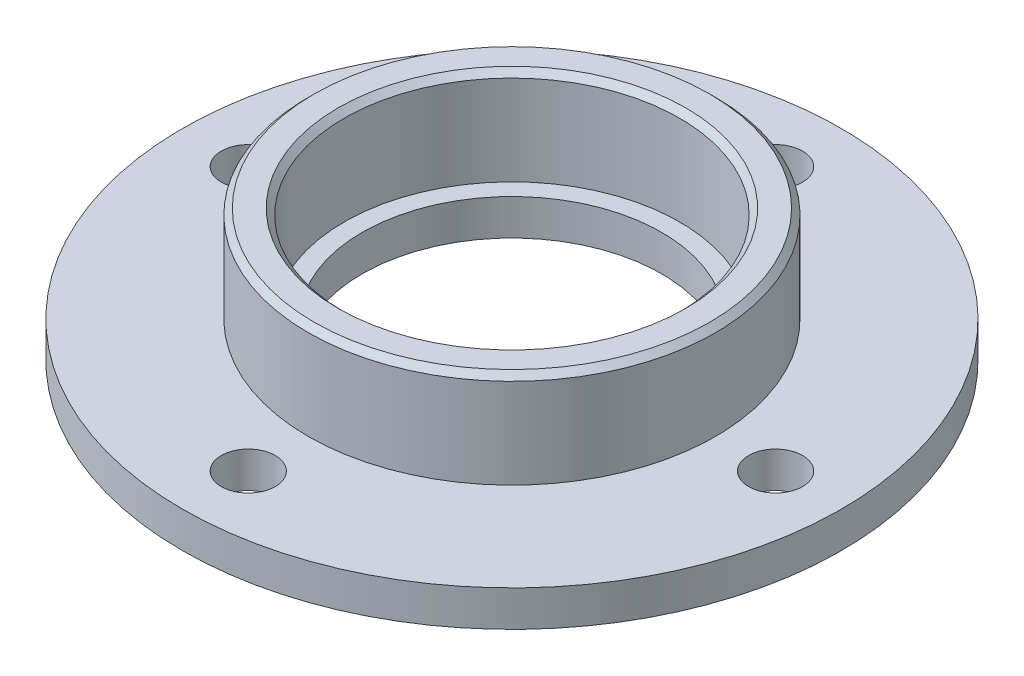
ISO-10303-21;
HEADER;
FILE_DESCRIPTION(('STEP AP214'),'2;1');
FILE_NAME('part.step','',(''),(''),'','','');
FILE_SCHEMA(('AUTOMOTIVE_DESIGN { 1 0 10303 214 1 1 1 1 }'));
ENDSEC;
DATA;
#1=APPLICATION_CONTEXT('core data for automotive mechanical design processes');
#2=APPLICATION_PROTOCOL_DEFINITION('international standard','automotive_design',2000,#1);
#3=PRODUCT_CONTEXT('',#1,'mechanical');
#4=PRODUCT('Part','Part','',(#3));
#5=PRODUCT_RELATED_PRODUCT_CATEGORY('part','',(#4));
#6=PRODUCT_DEFINITION_FORMATION('','',#4);
#7=PRODUCT_DEFINITION_CONTEXT('part definition',#1,'design');
#8=PRODUCT_DEFINITION('design','',#6,#7);
#9=PRODUCT_DEFINITION_SHAPE('','',#8);
#10=(LENGTH_UNIT() NAMED_UNIT(*) SI_UNIT(.MILLI.,.METRE.));
#11=(NAMED_UNIT(*) PLANE_ANGLE_UNIT() SI_UNIT($,.RADIAN.));
#12=(NAMED_UNIT(*) SI_UNIT($,.STERADIAN.) SOLID_ANGLE_UNIT());
#13=UNCERTAINTY_MEASURE_WITH_UNIT(LENGTH_MEASURE(1.E-05),#10,'distance_accuracy_value','');
#14=(GEOMETRIC_REPRESENTATION_CONTEXT(3) GLOBAL_UNCERTAINTY_ASSIGNED_CONTEXT((#13)) GLOBAL_UNIT_ASSIGNED_CONTEXT((#10,
#11,#12)) REPRESENTATION_CONTEXT('',''));
#15=CARTESIAN_POINT('',(0.,0.,0.));
#16=DIRECTION('',(0.,0.,1.));
#17=DIRECTION('',(1.,0.,0.));
#18=AXIS2_PLACEMENT_3D('',#15,#16,#17);
#19=CARTESIAN_POINT('',(0.,1.5,0.));
#20=DIRECTION('',(0.,1.,0.));
#21=DIRECTION('',(0.,0.,1.));
#22=AXIS2_PLACEMENT_3D('',#19,#20,#21);
#23=PLANE('',#22);
#24=CARTESIAN_POINT('',(0.,1.5,0.));
#25=DIRECTION('',(0.,1.,0.));
#26=DIRECTION('',(0.,0.,1.));
#27=AXIS2_PLACEMENT_3D('',#24,#25,#26);
#28=CIRCLE('',#27,12.5);
#29=CARTESIAN_POINT('',(0.,1.5,12.5));
#30=VERTEX_POINT('',#29);
#31=EDGE_CURVE('E133',#30,#30,#28,.T.);
#32=ORIENTED_EDGE('',*,*,#31,.F.);
#33=EDGE_LOOP('',(#32));
#34=FACE_BOUND('',#33,.T.);
#35=CARTESIAN_POINT('',(0.,1.5,0.));
#36=DIRECTION('',(0.,1.,0.));
#37=DIRECTION('',(0.,0.,1.));
#38=AXIS2_PLACEMENT_3D('',#35,#36,#37);
#39=CIRCLE('',#38,14.);
#40=CARTESIAN_POINT('',(0.,1.5,14.));
#41=VERTEX_POINT('',#40);
#42=EDGE_CURVE('E93',#41,#41,#39,.T.);
#43=ORIENTED_EDGE('',*,*,#42,.T.);
#44=EDGE_LOOP('',(#43));
#45=FACE_BOUND('',#44,.T.);
#46=ADVANCED_FACE('F68',(#34,#45),#23,.T.);
#47=CARTESIAN_POINT('',(0.,1.5,-22.));
#48=DIRECTION('',(0.,1.,0.));
#49=DIRECTION('',(0.,0.,1.));
#50=AXIS2_PLACEMENT_3D('',#47,#48,#49);
#51=CIRCLE('',#50,2.24999999999999);
#52=CARTESIAN_POINT('',(0.,1.5,-19.75));
#53=VERTEX_POINT('',#52);
#54=EDGE_CURVE('E117',#53,#53,#51,.T.);
#55=ORIENTED_EDGE('',*,*,#54,.F.);
#56=EDGE_LOOP('',(#55));
#57=FACE_BOUND('',#56,.T.);
#58=CARTESIAN_POINT('',(22.,1.5,0.));
#59=DIRECTION('',(0.,1.,0.));
#60=DIRECTION('',(0.,0.,1.));
#61=AXIS2_PLACEMENT_3D('',#58,#59,#60);
#62=CIRCLE('',#61,2.24999999999999);
#63=CARTESIAN_POINT('',(22.,1.5,2.24999999999999));
#64=VERTEX_POINT('',#63);
#65=EDGE_CURVE('E102',#64,#64,#62,.T.);
#66=ORIENTED_EDGE('',*,*,#65,.F.);
#67=EDGE_LOOP('',(#66));
#68=FACE_BOUND('',#67,.T.);
#69=CARTESIAN_POINT('',(-22.,1.5,0.));
#70=DIRECTION('',(0.,1.,0.));
#71=DIRECTION('',(0.,0.,1.));
#72=AXIS2_PLACEMENT_3D('',#69,#70,#71);
#73=CIRCLE('',#72,2.24999999999999);
#74=CARTESIAN_POINT('',(-22.,1.5,2.24999999999999));
#75=VERTEX_POINT('',#74);
#76=EDGE_CURVE('E98',#75,#75,#73,.T.);
#77=ORIENTED_EDGE('',*,*,#76,.F.);
#78=EDGE_LOOP('',(#77));
#79=FACE_BOUND('',#78,.T.);
#80=CARTESIAN_POINT('',(0.,1.5,22.));
#81=DIRECTION('',(0.,1.,0.));
#82=DIRECTION('',(0.,0.,1.));
#83=AXIS2_PLACEMENT_3D('',#80,#81,#82);
#84=CIRCLE('',#83,2.24999999999999);
#85=CARTESIAN_POINT('',(0.,1.5,24.25));
#86=VERTEX_POINT('',#85);
#87=EDGE_CURVE('E94',#86,#86,#84,.T.);
#88=ORIENTED_EDGE('',*,*,#87,.F.);
#89=EDGE_LOOP('',(#88));
#90=FACE_BOUND('',#89,.T.);
#91=CARTESIAN_POINT('',(0.,1.5,0.));
#92=DIRECTION('',(0.,1.,0.));
#93=DIRECTION('',(0.,0.,1.));
#94=AXIS2_PLACEMENT_3D('',#91,#92,#93);
#95=CIRCLE('',#94,17.);
#96=CARTESIAN_POINT('',(0.,1.5,17.));
#97=VERTEX_POINT('',#96);
#98=EDGE_CURVE('E127',#97,#97,#95,.T.);
#99=ORIENTED_EDGE('',*,*,#98,.F.);
#100=EDGE_LOOP('',(#99));
#101=FACE_BOUND('',#100,.T.);
#102=CARTESIAN_POINT('',(0.,1.5,0.));
#103=DIRECTION('',(0.,1.,0.));
#104=DIRECTION('',(0.,0.,1.));
#105=AXIS2_PLACEMENT_3D('',#102,#103,#104);
#106=CIRCLE('',#105,27.5);
#107=CARTESIAN_POINT('',(0.,1.5,27.5));
#108=VERTEX_POINT('',#107);
#109=EDGE_CURVE('E132',#108,#108,#106,.T.);
#110=ORIENTED_EDGE('',*,*,#109,.T.);
#111=EDGE_LOOP('',(#110));
#112=FACE_BOUND('',#111,.T.);
#113=ADVANCED_FACE('F173',(#57,#68,#79,#90,#101,#112),#23,.T.);
#114=CARTESIAN_POINT('',(0.,-1.5,0.));
#115=DIRECTION('',(0.,1.,0.));
#116=DIRECTION('',(0.,0.,1.));
#117=AXIS2_PLACEMENT_3D('',#114,#115,#116);
#118=PLANE('',#117);
#119=CARTESIAN_POINT('',(0.,-1.5,-22.));
#120=DIRECTION('',(0.,1.,0.));
#121=DIRECTION('',(0.,0.,1.));
#122=AXIS2_PLACEMENT_3D('',#119,#120,#121);
#123=CIRCLE('',#122,2.24999999999999);
#124=CARTESIAN_POINT('',(0.,-1.5,-19.75));
#125=VERTEX_POINT('',#124);
#126=EDGE_CURVE('E73',#125,#125,#123,.T.);
#127=ORIENTED_EDGE('',*,*,#126,.T.);
#128=EDGE_LOOP('',(#127));
#129=FACE_BOUND('',#128,.T.);
#130=CARTESIAN_POINT('',(22.,-1.5,0.));
#131=DIRECTION('',(0.,1.,0.));
#132=DIRECTION('',(0.,0.,1.));
#133=AXIS2_PLACEMENT_3D('',#130,#131,#132);
#134=CIRCLE('',#133,2.24999999999999);
#135=CARTESIAN_POINT('',(22.,-1.5,2.24999999999999));
#136=VERTEX_POINT('',#135);
#137=EDGE_CURVE('E99',#136,#136,#134,.T.);
#138=ORIENTED_EDGE('',*,*,#137,.T.);
#139=EDGE_LOOP('',(#138));
#140=FACE_BOUND('',#139,.T.);
#141=CARTESIAN_POINT('',(-22.,-1.5,0.));
#142=DIRECTION('',(0.,1.,0.));
#143=DIRECTION('',(0.,0.,1.));
#144=AXIS2_PLACEMENT_3D('',#141,#142,#143);
#145=CIRCLE('',#144,2.24999999999999);
#146=CARTESIAN_POINT('',(-22.,-1.5,2.24999999999999));
#147=VERTEX_POINT('',#146);
#148=EDGE_CURVE('E95',#147,#147,#145,.T.);
#149=ORIENTED_EDGE('',*,*,#148,.T.);
#150=EDGE_LOOP('',(#149));
#151=FACE_BOUND('',#150,.T.);
#152=CARTESIAN_POINT('',(0.,-1.5,22.));
#153=DIRECTION('',(0.,1.,0.));
#154=DIRECTION('',(0.,0.,1.));
#155=AXIS2_PLACEMENT_3D('',#152,#153,#154);
#156=CIRCLE('',#155,2.24999999999999);
#157=CARTESIAN_POINT('',(0.,-1.5,24.25));
#158=VERTEX_POINT('',#157);
#159=EDGE_CURVE('E89',#158,#158,#156,.T.);
#160=ORIENTED_EDGE('',*,*,#159,.T.);
#161=EDGE_LOOP('',(#160));
#162=FACE_BOUND('',#161,.T.);
#163=CARTESIAN_POINT('',(0.,-1.5,0.));
#164=DIRECTION('',(0.,1.,0.));
#165=DIRECTION('',(0.,0.,1.));
#166=AXIS2_PLACEMENT_3D('',#163,#164,#165);
#167=CIRCLE('',#166,27.5);
#168=CARTESIAN_POINT('',(0.,-1.5,27.5));
#169=VERTEX_POINT('',#168);
#170=EDGE_CURVE('E137',#169,#169,#167,.T.);
#171=ORIENTED_EDGE('',*,*,#170,.F.);
#172=EDGE_LOOP('',(#171));
#173=FACE_BOUND('',#172,.T.);
#174=CARTESIAN_POINT('',(0.,-1.5,0.));
#175=DIRECTION('',(0.,1.,0.));
#176=DIRECTION('',(0.,0.,1.));
#177=AXIS2_PLACEMENT_3D('',#174,#175,#176);
#178=CIRCLE('',#177,12.5);
#179=CARTESIAN_POINT('',(0.,-1.5,12.5));
#180=VERTEX_POINT('',#179);
#181=EDGE_CURVE('E126',#180,#180,#178,.T.);
#182=ORIENTED_EDGE('',*,*,#181,.T.);
#183=EDGE_LOOP('',(#182));
#184=FACE_BOUND('',#183,.T.);
#185=ADVANCED_FACE('F181',(#129,#140,#151,#162,#173,#184),#118,.F.);
#186=CARTESIAN_POINT('',(0.,1.5,0.));
#187=DIRECTION('',(0.,-1.,0.));
#188=DIRECTION('',(0.,0.,-1.));
#189=AXIS2_PLACEMENT_3D('',#186,#187,#188);
#190=CYLINDRICAL_SURFACE('',#189,27.5);
#191=ORIENTED_EDGE('',*,*,#109,.F.);
#192=EDGE_LOOP('',(#191));
#193=FACE_BOUND('',#192,.T.);
#194=ORIENTED_EDGE('',*,*,#170,.T.);
#195=EDGE_LOOP('',(#194));
#196=FACE_BOUND('',#195,.T.);
#197=ADVANCED_FACE('F190',(#193,#196),#190,.T.);
#198=CARTESIAN_POINT('',(0.,1.5,0.));
#199=DIRECTION('',(0.,-1.,0.));
#200=DIRECTION('',(0.,0.,-1.));
#201=AXIS2_PLACEMENT_3D('',#198,#199,#200);
#202=CYLINDRICAL_SURFACE('',#201,12.5);
#203=ORIENTED_EDGE('',*,*,#31,.T.);
#204=EDGE_LOOP('',(#203));
#205=FACE_BOUND('',#204,.T.);
#206=ORIENTED_EDGE('',*,*,#181,.F.);
#207=EDGE_LOOP('',(#206));
#208=FACE_BOUND('',#207,.T.);
#209=ADVANCED_FACE('F187',(#205,#208),#202,.F.);
#210=CARTESIAN_POINT('',(0.,9.5,0.));
#211=DIRECTION('',(0.,1.,0.));
#212=DIRECTION('',(0.,0.,1.));
#213=AXIS2_PLACEMENT_3D('',#210,#211,#212);
#214=PLANE('',#213);
#215=CARTESIAN_POINT('',(0.,9.5,0.));
#216=DIRECTION('',(0.,1.,0.));
#217=DIRECTION('',(0.,0.,1.));
#218=AXIS2_PLACEMENT_3D('',#215,#216,#217);
#219=CIRCLE('',#218,16.5);
#220=CARTESIAN_POINT('',(0.,9.5,16.5));
#221=VERTEX_POINT('',#220);
#222=EDGE_CURVE('E85',#221,#221,#219,.T.);
#223=ORIENTED_EDGE('',*,*,#222,.T.);
#224=EDGE_LOOP('',(#223));
#225=FACE_BOUND('',#224,.T.);
#226=CARTESIAN_POINT('',(0.,9.5,0.));
#227=DIRECTION('',(0.,1.,0.));
#228=DIRECTION('',(0.,0.,1.));
#229=AXIS2_PLACEMENT_3D('',#226,#227,#228);
#230=CIRCLE('',#229,14.5);
#231=CARTESIAN_POINT('',(0.,9.5,14.5));
#232=VERTEX_POINT('',#231);
#233=EDGE_CURVE('E131',#232,#232,#230,.F.);
#234=ORIENTED_EDGE('',*,*,#233,.T.);
#235=EDGE_LOOP('',(#234));
#236=FACE_BOUND('',#235,.T.);
#237=ADVANCED_FACE('F154',(#225,#236),#214,.T.);
#238=CARTESIAN_POINT('',(0.,9.5,0.));
#239=DIRECTION('',(0.,-1.,0.));
#240=DIRECTION('',(0.,0.,-1.));
#241=AXIS2_PLACEMENT_3D('',#238,#239,#240);
#242=CYLINDRICAL_SURFACE('',#241,17.);
#243=CARTESIAN_POINT('',(0.,9.00000000000001,0.));
#244=DIRECTION('',(0.,1.,0.));
#245=DIRECTION('',(0.,0.,1.));
#246=AXIS2_PLACEMENT_3D('',#243,#244,#245);
#247=CIRCLE('',#246,17.);
#248=CARTESIAN_POINT('',(0.,9.00000000000001,17.));
#249=VERTEX_POINT('',#248);
#250=EDGE_CURVE('E78',#249,#249,#247,.F.);
#251=ORIENTED_EDGE('',*,*,#250,.T.);
#252=EDGE_LOOP('',(#251));
#253=FACE_BOUND('',#252,.T.);
#254=ORIENTED_EDGE('',*,*,#98,.T.);
#255=EDGE_LOOP('',(#254));
#256=FACE_BOUND('',#255,.T.);
#257=ADVANCED_FACE('F167',(#253,#256),#242,.T.);
#258=CARTESIAN_POINT('',(0.,9.5,0.));
#259=DIRECTION('',(0.,-1.,0.));
#260=DIRECTION('',(0.,0.,-1.));
#261=AXIS2_PLACEMENT_3D('',#258,#259,#260);
#262=CYLINDRICAL_SURFACE('',#261,14.);
#263=CARTESIAN_POINT('',(0.,8.99999999999999,0.));
#264=DIRECTION('',(0.,1.,0.));
#265=DIRECTION('',(0.,0.,1.));
#266=AXIS2_PLACEMENT_3D('',#263,#264,#265);
#267=CIRCLE('',#266,14.);
#268=CARTESIAN_POINT('',(0.,8.99999999999999,14.));
#269=VERTEX_POINT('',#268);
#270=EDGE_CURVE('E11',#269,#269,#267,.T.);
#271=ORIENTED_EDGE('',*,*,#270,.T.);
#272=EDGE_LOOP('',(#271));
#273=FACE_BOUND('',#272,.T.);
#274=ORIENTED_EDGE('',*,*,#42,.F.);
#275=EDGE_LOOP('',(#274));
#276=FACE_BOUND('',#275,.T.);
#277=ADVANCED_FACE('F159',(#273,#276),#262,.F.);
#278=CARTESIAN_POINT('',(0.,9.5,0.));
#279=DIRECTION('',(0.,-1.,0.));
#280=DIRECTION('',(0.,0.,-1.));
#281=AXIS2_PLACEMENT_3D('',#278,#279,#280);
#282=CONICAL_SURFACE('',#281,16.5,0.785398163397448);
#283=ORIENTED_EDGE('',*,*,#250,.F.);
#284=EDGE_LOOP('',(#283));
#285=FACE_BOUND('',#284,.T.);
#286=ORIENTED_EDGE('',*,*,#222,.F.);
#287=EDGE_LOOP('',(#286));
#288=FACE_BOUND('',#287,.T.);
#289=ADVANCED_FACE('F157',(#285,#288),#282,.T.);
#290=CARTESIAN_POINT('',(0.,8.99999999999999,0.));
#291=DIRECTION('',(0.,1.,0.));
#292=DIRECTION('',(0.,0.,1.));
#293=AXIS2_PLACEMENT_3D('',#290,#291,#292);
#294=CONICAL_SURFACE('',#293,14.,0.785398163397441);
#295=ORIENTED_EDGE('',*,*,#233,.F.);
#296=EDGE_LOOP('',(#295));
#297=FACE_BOUND('',#296,.T.);
#298=ORIENTED_EDGE('',*,*,#270,.F.);
#299=EDGE_LOOP('',(#298));
#300=FACE_BOUND('',#299,.T.);
#301=ADVANCED_FACE('F71',(#297,#300),#294,.F.);
#302=CARTESIAN_POINT('',(0.,1.5,22.));
#303=DIRECTION('',(0.,1.,0.));
#304=DIRECTION('',(0.,0.,1.));
#305=AXIS2_PLACEMENT_3D('',#302,#303,#304);
#306=CYLINDRICAL_SURFACE('',#305,2.24999999999999);
#307=ORIENTED_EDGE('',*,*,#87,.T.);
#308=EDGE_LOOP('',(#307));
#309=FACE_BOUND('',#308,.T.);
#310=ORIENTED_EDGE('',*,*,#159,.F.);
#311=EDGE_LOOP('',(#310));
#312=FACE_BOUND('',#311,.T.);
#313=ADVANCED_FACE('F165',(#309,#312),#306,.F.);
#314=CARTESIAN_POINT('',(-22.,1.5,0.));
#315=DIRECTION('',(0.,1.,0.));
#316=DIRECTION('',(0.,0.,1.));
#317=AXIS2_PLACEMENT_3D('',#314,#315,#316);
#318=CYLINDRICAL_SURFACE('',#317,2.24999999999999);
#319=ORIENTED_EDGE('',*,*,#76,.T.);
#320=EDGE_LOOP('',(#319));
#321=FACE_BOUND('',#320,.T.);
#322=ORIENTED_EDGE('',*,*,#148,.F.);
#323=EDGE_LOOP('',(#322));
#324=FACE_BOUND('',#323,.T.);
#325=ADVANCED_FACE('F215',(#321,#324),#318,.F.);
#326=CARTESIAN_POINT('',(22.,1.5,0.));
#327=DIRECTION('',(0.,1.,0.));
#328=DIRECTION('',(0.,0.,1.));
#329=AXIS2_PLACEMENT_3D('',#326,#327,#328);
#330=CYLINDRICAL_SURFACE('',#329,2.24999999999999);
#331=ORIENTED_EDGE('',*,*,#65,.T.);
#332=EDGE_LOOP('',(#331));
#333=FACE_BOUND('',#332,.T.);
#334=ORIENTED_EDGE('',*,*,#137,.F.);
#335=EDGE_LOOP('',(#334));
#336=FACE_BOUND('',#335,.T.);
#337=ADVANCED_FACE('F219',(#333,#336),#330,.F.);
#338=CARTESIAN_POINT('',(0.,1.5,-22.));
#339=DIRECTION('',(0.,1.,0.));
#340=DIRECTION('',(0.,0.,1.));
#341=AXIS2_PLACEMENT_3D('',#338,#339,#340);
#342=CYLINDRICAL_SURFACE('',#341,2.24999999999999);
#343=ORIENTED_EDGE('',*,*,#54,.T.);
#344=EDGE_LOOP('',(#343));
#345=FACE_BOUND('',#344,.T.);
#346=ORIENTED_EDGE('',*,*,#126,.F.);
#347=EDGE_LOOP('',(#346));
#348=FACE_BOUND('',#347,.T.);
#349=ADVANCED_FACE('F223',(#345,#348),#342,.F.);
#350=CLOSED_SHELL('',(#46,#113,#185,#197,#209,#237,#257,#277,#289,#301,#313,#325,#337,#349));
#351=MANIFOLD_SOLID_BREP('B2',#350);
#352=ADVANCED_BREP_SHAPE_REPRESENTATION('',(#18,#351),#14);
#353=SHAPE_DEFINITION_REPRESENTATION(#9,#352);
ENDSEC;
END-ISO-10303-21;
